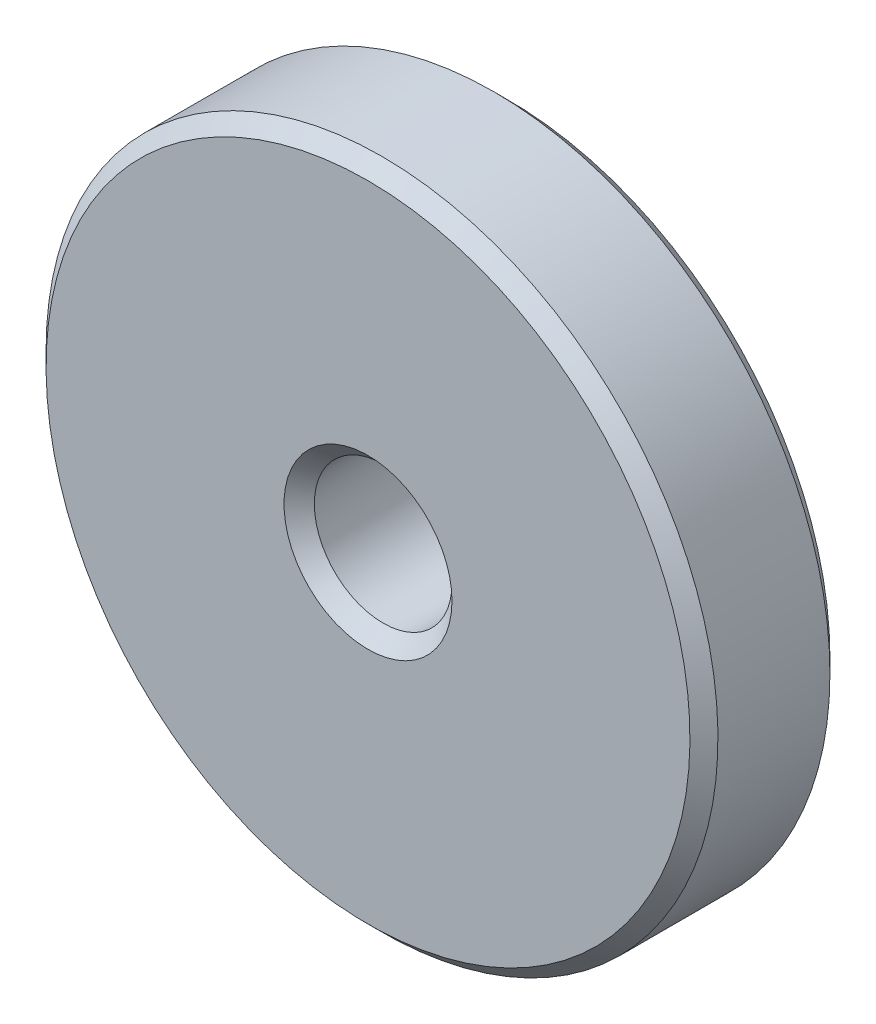
ISO-10303-21;
HEADER;
FILE_DESCRIPTION(('STEP AP214'),'2;1');
FILE_NAME('part.step','',(''),(''),'','','');
FILE_SCHEMA(('AUTOMOTIVE_DESIGN { 1 0 10303 214 1 1 1 1 }'));
ENDSEC;
DATA;
#1=APPLICATION_CONTEXT('core data for automotive mechanical design processes');
#2=APPLICATION_PROTOCOL_DEFINITION('international standard','automotive_design',2000,#1);
#3=PRODUCT_CONTEXT('',#1,'mechanical');
#4=PRODUCT('Part','Part','',(#3));
#5=PRODUCT_RELATED_PRODUCT_CATEGORY('part','',(#4));
#6=PRODUCT_DEFINITION_FORMATION('','',#4);
#7=PRODUCT_DEFINITION_CONTEXT('part definition',#1,'design');
#8=PRODUCT_DEFINITION('design','',#6,#7);
#9=PRODUCT_DEFINITION_SHAPE('','',#8);
#10=(LENGTH_UNIT() NAMED_UNIT(*) SI_UNIT(.MILLI.,.METRE.));
#11=(NAMED_UNIT(*) PLANE_ANGLE_UNIT() SI_UNIT($,.RADIAN.));
#12=(NAMED_UNIT(*) SI_UNIT($,.STERADIAN.) SOLID_ANGLE_UNIT());
#13=UNCERTAINTY_MEASURE_WITH_UNIT(LENGTH_MEASURE(1.E-05),#10,'distance_accuracy_value','');
#14=(GEOMETRIC_REPRESENTATION_CONTEXT(3) GLOBAL_UNCERTAINTY_ASSIGNED_CONTEXT((#13)) GLOBAL_UNIT_ASSIGNED_CONTEXT((#10,
#11,#12)) REPRESENTATION_CONTEXT('',''));
#15=CARTESIAN_POINT('',(0.,0.,0.));
#16=DIRECTION('',(0.,0.,1.));
#17=DIRECTION('',(1.,0.,0.));
#18=AXIS2_PLACEMENT_3D('',#15,#16,#17);
#19=CARTESIAN_POINT('',(-124.615770245502,-679.905523336292,-814.608147986318));
#20=DIRECTION('',(0.,0.,1.));
#21=DIRECTION('',(0.,1.,0.));
#22=AXIS2_PLACEMENT_3D('',#19,#20,#21);
#23=TOROIDAL_SURFACE('',#22,7.00000000000001,1.);
#24=CARTESIAN_POINT('',(-124.615770245502,-679.905523336292,-814.608147986318));
#25=DIRECTION('',(0.,0.,1.));
#26=DIRECTION('',(0.,-1.,0.));
#27=AXIS2_PLACEMENT_3D('',#24,#25,#26);
#28=CIRCLE('',#27,6.00000000000001);
#29=CARTESIAN_POINT('',(-124.615770245502,-685.905523336292,-814.608147986318));
#30=VERTEX_POINT('',#29);
#31=EDGE_CURVE('E45',#30,#30,#28,.F.);
#32=ORIENTED_EDGE('',*,*,#31,.F.);
#33=EDGE_LOOP('',(#32));
#34=FACE_BOUND('',#33,.T.);
#35=CARTESIAN_POINT('',(-124.615770245502,-679.905523336292,-813.608147986318));
#36=DIRECTION('',(0.,0.,-1.));
#37=DIRECTION('',(0.,1.,0.));
#38=AXIS2_PLACEMENT_3D('',#35,#36,#37);
#39=CIRCLE('',#38,6.9999999999999);
#40=CARTESIAN_POINT('',(-124.615770245502,-686.905523336292,-813.608147986318));
#41=VERTEX_POINT('',#40);
#42=CARTESIAN_POINT('',(-124.615770245502,-672.905523336292,-813.608147986318));
#43=VERTEX_POINT('',#42);
#44=EDGE_CURVE('E38',#41,#43,#39,.F.);
#45=ORIENTED_EDGE('',*,*,#44,.F.);
#46=CARTESIAN_POINT('',(-124.615770245502,-679.905523336292,-813.608147986318));
#47=DIRECTION('',(0.,0.,-1.));
#48=DIRECTION('',(0.,-1.,0.));
#49=AXIS2_PLACEMENT_3D('',#46,#47,#48);
#50=CIRCLE('',#49,7.00000000000001);
#51=EDGE_CURVE('E35',#43,#41,#50,.F.);
#52=ORIENTED_EDGE('',*,*,#51,.F.);
#53=EDGE_LOOP('',(#45,#52));
#54=FACE_BOUND('',#53,.T.);
#55=ADVANCED_FACE('F17',(#34,#54),#23,.F.);
#56=CARTESIAN_POINT('',(-133.865770245502,-679.905523336292,-813.608147986319));
#57=DIRECTION('',(0.,0.,-1.));
#58=DIRECTION('',(0.,1.,0.));
#59=AXIS2_PLACEMENT_3D('',#56,#57,#58);
#60=PLANE('',#59);
#61=ORIENTED_EDGE('',*,*,#44,.T.);
#62=ORIENTED_EDGE('',*,*,#51,.T.);
#63=EDGE_LOOP('',(#61,#62));
#64=FACE_BOUND('',#63,.T.);
#65=CARTESIAN_POINT('',(-124.615770245502,-679.905523336292,-813.608147986319));
#66=DIRECTION('',(0.,0.,1.));
#67=DIRECTION('',(1.,0.,0.));
#68=AXIS2_PLACEMENT_3D('',#65,#66,#67);
#69=CIRCLE('',#68,11.499999999999);
#70=CARTESIAN_POINT('',(-113.115770245503,-679.905523336292,-813.608147986319));
#71=VERTEX_POINT('',#70);
#72=EDGE_CURVE('E111',#71,#71,#69,.T.);
#73=ORIENTED_EDGE('',*,*,#72,.F.);
#74=EDGE_LOOP('',(#73));
#75=FACE_BOUND('',#74,.T.);
#76=ADVANCED_FACE('F43',(#64,#75),#60,.T.);
#77=CARTESIAN_POINT('',(-129.115770245502,-679.905523336292,-814.608147986318));
#78=DIRECTION('',(0.,0.,-1.));
#79=DIRECTION('',(0.,1.,0.));
#80=AXIS2_PLACEMENT_3D('',#77,#78,#79);
#81=PLANE('',#80);
#82=CARTESIAN_POINT('',(-124.615770245502,-679.905523336292,-814.608147986319));
#83=DIRECTION('',(0.,0.,-1.));
#84=DIRECTION('',(-1.,0.,0.));
#85=AXIS2_PLACEMENT_3D('',#82,#83,#84);
#86=CIRCLE('',#85,2.99999999999954);
#87=CARTESIAN_POINT('',(-127.615770245502,-679.905523336292,-814.608147986319));
#88=VERTEX_POINT('',#87);
#89=EDGE_CURVE('E107',#88,#88,#86,.F.);
#90=ORIENTED_EDGE('',*,*,#89,.T.);
#91=EDGE_LOOP('',(#90));
#92=FACE_BOUND('',#91,.T.);
#93=ORIENTED_EDGE('',*,*,#31,.T.);
#94=EDGE_LOOP('',(#93));
#95=FACE_BOUND('',#94,.T.);
#96=ADVANCED_FACE('F61',(#92,#95),#81,.T.);
#97=CARTESIAN_POINT('',(-124.615770245502,-679.905523336292,-813.108147986319));
#98=DIRECTION('',(0.,0.,1.));
#99=DIRECTION('',(1.,0.,0.));
#100=AXIS2_PLACEMENT_3D('',#97,#98,#99);
#101=CONICAL_SURFACE('',#100,11.999999999999,0.785398163397448);
#102=CARTESIAN_POINT('',(-124.615770245502,-679.905523336292,-813.108147986319));
#103=DIRECTION('',(0.,0.,-1.));
#104=DIRECTION('',(0.,1.,0.));
#105=AXIS2_PLACEMENT_3D('',#102,#103,#104);
#106=CIRCLE('',#105,12.);
#107=CARTESIAN_POINT('',(-124.615770245502,-667.905523336292,-813.108147986319));
#108=VERTEX_POINT('',#107);
#109=EDGE_CURVE('E110',#108,#108,#106,.F.);
#110=ORIENTED_EDGE('',*,*,#109,.F.);
#111=EDGE_LOOP('',(#110));
#112=FACE_BOUND('',#111,.T.);
#113=ORIENTED_EDGE('',*,*,#72,.T.);
#114=EDGE_LOOP('',(#113));
#115=FACE_BOUND('',#114,.T.);
#116=ADVANCED_FACE('F65',(#112,#115),#101,.T.);
#117=CARTESIAN_POINT('',(-124.615770245502,-679.905523336292,-814.608147986319));
#118=DIRECTION('',(0.,0.,-1.));
#119=DIRECTION('',(-1.,0.,0.));
#120=AXIS2_PLACEMENT_3D('',#117,#118,#119);
#121=CONICAL_SURFACE('',#120,2.99999999999954,0.785398163397448);
#122=CARTESIAN_POINT('',(-124.615770245502,-679.905523336292,-814.066897986319));
#123=DIRECTION('',(0.,0.,-1.));
#124=DIRECTION('',(0.,1.,0.));
#125=AXIS2_PLACEMENT_3D('',#122,#123,#124);
#126=CIRCLE('',#125,2.45875);
#127=CARTESIAN_POINT('',(-124.615770245502,-677.446773336292,-814.066897986319));
#128=VERTEX_POINT('',#127);
#129=EDGE_CURVE('E187',#128,#128,#126,.F.);
#130=ORIENTED_EDGE('',*,*,#129,.T.);
#131=EDGE_LOOP('',(#130));
#132=FACE_BOUND('',#131,.T.);
#133=ORIENTED_EDGE('',*,*,#89,.F.);
#134=EDGE_LOOP('',(#133));
#135=FACE_BOUND('',#134,.T.);
#136=ADVANCED_FACE('F69',(#132,#135),#121,.F.);
#137=CARTESIAN_POINT('',(-124.615770245502,-679.905523336292,-811.108147986319));
#138=DIRECTION('',(0.,0.,-1.));
#139=DIRECTION('',(0.,1.,0.));
#140=AXIS2_PLACEMENT_3D('',#137,#138,#139);
#141=CYLINDRICAL_SURFACE('',#140,12.);
#142=CARTESIAN_POINT('',(-124.615770245502,-679.905523336292,-809.108147986318));
#143=DIRECTION('',(0.,0.,-1.));
#144=DIRECTION('',(-1.,0.,0.));
#145=AXIS2_PLACEMENT_3D('',#142,#143,#144);
#146=CIRCLE('',#145,12.);
#147=CARTESIAN_POINT('',(-136.615770245502,-679.905523336292,-809.108147986318));
#148=VERTEX_POINT('',#147);
#149=EDGE_CURVE('E103',#148,#148,#146,.F.);
#150=ORIENTED_EDGE('',*,*,#149,.F.);
#151=EDGE_LOOP('',(#150));
#152=FACE_BOUND('',#151,.T.);
#153=ORIENTED_EDGE('',*,*,#109,.T.);
#154=EDGE_LOOP('',(#153));
#155=FACE_BOUND('',#154,.T.);
#156=ADVANCED_FACE('F73',(#152,#155),#141,.T.);
#157=CARTESIAN_POINT('',(-124.615770245502,-679.905523336292,-811.60814798632));
#158=DIRECTION('',(0.,0.,-1.));
#159=DIRECTION('',(0.,1.,0.));
#160=AXIS2_PLACEMENT_3D('',#157,#158,#159);
#161=CYLINDRICAL_SURFACE('',#160,2.45875);
#162=ORIENTED_EDGE('',*,*,#129,.F.);
#163=EDGE_LOOP('',(#162));
#164=FACE_BOUND('',#163,.T.);
#165=CARTESIAN_POINT('',(-124.615770245502,-679.905523336292,-809.149397986318));
#166=DIRECTION('',(0.,0.,1.));
#167=DIRECTION('',(-1.,0.,0.));
#168=AXIS2_PLACEMENT_3D('',#165,#166,#167);
#169=CIRCLE('',#168,2.45874999999997);
#170=CARTESIAN_POINT('',(-127.074520245502,-679.905523336292,-809.149397986318));
#171=VERTEX_POINT('',#170);
#172=EDGE_CURVE('E100',#171,#171,#169,.T.);
#173=ORIENTED_EDGE('',*,*,#172,.T.);
#174=EDGE_LOOP('',(#173));
#175=FACE_BOUND('',#174,.T.);
#176=ADVANCED_FACE('F77',(#164,#175),#161,.F.);
#177=CARTESIAN_POINT('',(-124.615770245502,-679.905523336292,-809.108147986318));
#178=DIRECTION('',(0.,0.,-1.));
#179=DIRECTION('',(-1.,0.,0.));
#180=AXIS2_PLACEMENT_3D('',#177,#178,#179);
#181=CONICAL_SURFACE('',#180,12.,0.785398163397448);
#182=CARTESIAN_POINT('',(-124.615770245502,-679.905523336292,-808.608147986319));
#183=DIRECTION('',(0.,0.,-1.));
#184=DIRECTION('',(0.,1.,0.));
#185=AXIS2_PLACEMENT_3D('',#182,#183,#184);
#186=CIRCLE('',#185,11.500000000001);
#187=CARTESIAN_POINT('',(-124.615770245502,-668.405523336291,-808.608147986319));
#188=VERTEX_POINT('',#187);
#189=EDGE_CURVE('E29',#188,#188,#186,.F.);
#190=ORIENTED_EDGE('',*,*,#189,.F.);
#191=EDGE_LOOP('',(#190));
#192=FACE_BOUND('',#191,.T.);
#193=ORIENTED_EDGE('',*,*,#149,.T.);
#194=EDGE_LOOP('',(#193));
#195=FACE_BOUND('',#194,.T.);
#196=ADVANCED_FACE('F81',(#192,#195),#181,.T.);
#197=CARTESIAN_POINT('',(-124.615770245502,-679.905523336292,-808.608147986319));
#198=DIRECTION('',(0.,0.,1.));
#199=DIRECTION('',(1.,0.,0.));
#200=AXIS2_PLACEMENT_3D('',#197,#198,#199);
#201=CONICAL_SURFACE('',#200,2.99999999999857,0.785398163397448);
#202=ORIENTED_EDGE('',*,*,#172,.F.);
#203=EDGE_LOOP('',(#202));
#204=FACE_BOUND('',#203,.T.);
#205=CARTESIAN_POINT('',(-124.615770245502,-679.905523336292,-808.608147986318));
#206=DIRECTION('',(0.,0.,1.));
#207=DIRECTION('',(1.,0.,0.));
#208=AXIS2_PLACEMENT_3D('',#205,#206,#207);
#209=CIRCLE('',#208,2.99999999999946);
#210=CARTESIAN_POINT('',(-121.615770245503,-679.905523336292,-808.608147986318));
#211=VERTEX_POINT('',#210);
#212=EDGE_CURVE('E11',#211,#211,#209,.F.);
#213=ORIENTED_EDGE('',*,*,#212,.F.);
#214=EDGE_LOOP('',(#213));
#215=FACE_BOUND('',#214,.T.);
#216=ADVANCED_FACE('F85',(#204,#215),#201,.F.);
#217=CARTESIAN_POINT('',(-131.865770245502,-679.905523336292,-808.608147986319));
#218=DIRECTION('',(0.,0.,1.));
#219=DIRECTION('',(0.,-1.,0.));
#220=AXIS2_PLACEMENT_3D('',#217,#218,#219);
#221=PLANE('',#220);
#222=ORIENTED_EDGE('',*,*,#212,.T.);
#223=EDGE_LOOP('',(#222));
#224=FACE_BOUND('',#223,.T.);
#225=ORIENTED_EDGE('',*,*,#189,.T.);
#226=EDGE_LOOP('',(#225));
#227=FACE_BOUND('',#226,.T.);
#228=ADVANCED_FACE('F89',(#224,#227),#221,.T.);
#229=CLOSED_SHELL('',(#55,#76,#96,#116,#136,#156,#176,#196,#216,#228));
#230=MANIFOLD_SOLID_BREP('B1',#229);
#231=ADVANCED_BREP_SHAPE_REPRESENTATION('',(#18,#230),#14);
#232=SHAPE_DEFINITION_REPRESENTATION(#9,#231);
ENDSEC;
END-ISO-10303-21;
